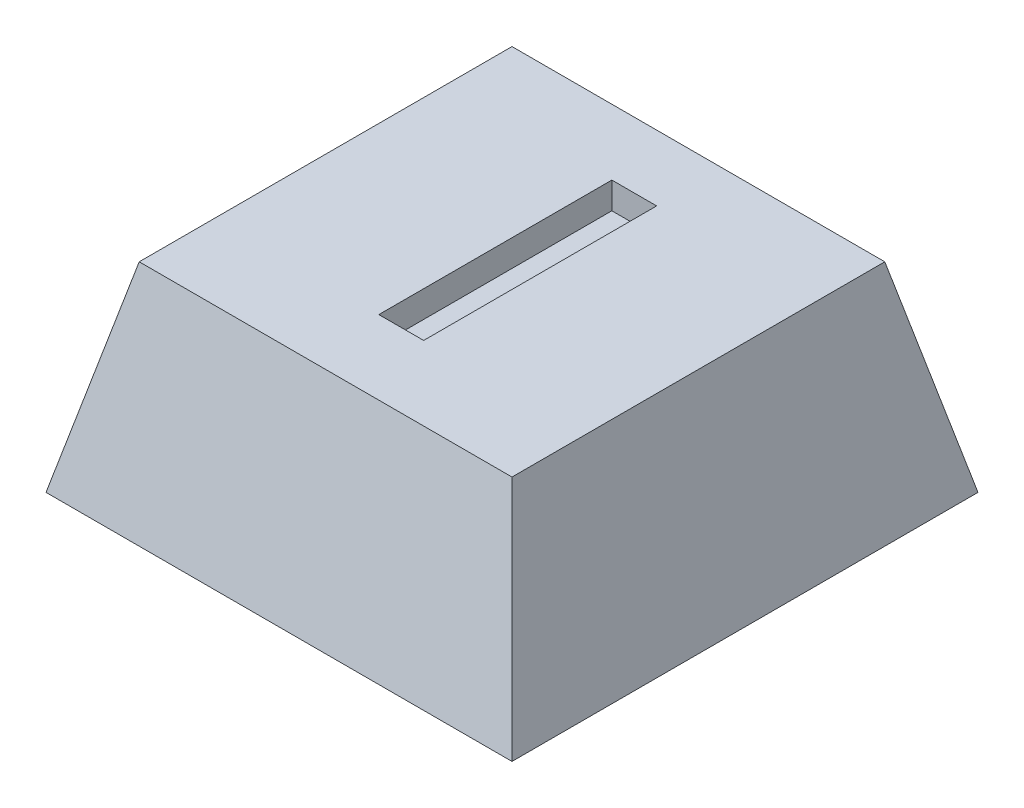
ISO-10303-21;
HEADER;
FILE_DESCRIPTION(('STEP AP214'),'2;1');
FILE_NAME('part.step','',(''),(''),'','','');
FILE_SCHEMA(('AUTOMOTIVE_DESIGN { 1 0 10303 214 1 1 1 1 }'));
ENDSEC;
DATA;
#1=APPLICATION_CONTEXT('core data for automotive mechanical design processes');
#2=APPLICATION_PROTOCOL_DEFINITION('international standard','automotive_design',2000,#1);
#3=PRODUCT_CONTEXT('',#1,'mechanical');
#4=PRODUCT('Part','Part','',(#3));
#5=PRODUCT_RELATED_PRODUCT_CATEGORY('part','',(#4));
#6=PRODUCT_DEFINITION_FORMATION('','',#4);
#7=PRODUCT_DEFINITION_CONTEXT('part definition',#1,'design');
#8=PRODUCT_DEFINITION('design','',#6,#7);
#9=PRODUCT_DEFINITION_SHAPE('','',#8);
#10=(LENGTH_UNIT() NAMED_UNIT(*) SI_UNIT(.MILLI.,.METRE.));
#11=(NAMED_UNIT(*) PLANE_ANGLE_UNIT() SI_UNIT($,.RADIAN.));
#12=(NAMED_UNIT(*) SI_UNIT($,.STERADIAN.) SOLID_ANGLE_UNIT());
#13=UNCERTAINTY_MEASURE_WITH_UNIT(LENGTH_MEASURE(1.E-05),#10,'distance_accuracy_value','');
#14=(GEOMETRIC_REPRESENTATION_CONTEXT(3) GLOBAL_UNCERTAINTY_ASSIGNED_CONTEXT((#13)) GLOBAL_UNIT_ASSIGNED_CONTEXT((#10,
#11,#12)) REPRESENTATION_CONTEXT('',''));
#15=CARTESIAN_POINT('',(0.,0.,0.));
#16=DIRECTION('',(0.,0.,1.));
#17=DIRECTION('',(1.,0.,0.));
#18=AXIS2_PLACEMENT_3D('',#15,#16,#17);
#19=CARTESIAN_POINT('',(0.,3.,0.));
#20=DIRECTION('',(0.,-1.,0.));
#21=DIRECTION('',(0.,0.,-1.));
#22=AXIS2_PLACEMENT_3D('',#19,#20,#21);
#23=PLANE('',#22);
#24=DIRECTION('',(-1.,0.,0.));
#25=VECTOR('',#24,1.);
#26=CARTESIAN_POINT('',(11.,3.,-0.7));
#27=LINE('',#26,#25);
#28=CARTESIAN_POINT('',(6.3,3.,-0.7));
#29=VERTEX_POINT('',#28);
#30=CARTESIAN_POINT('',(0.7,3.,-0.7));
#31=VERTEX_POINT('',#30);
#32=EDGE_CURVE('E66',#29,#31,#27,.T.);
#33=ORIENTED_EDGE('',*,*,#32,.F.);
#34=DIRECTION('',(0.,0.,1.));
#35=VECTOR('',#34,1.);
#36=CARTESIAN_POINT('',(6.3,3.,-7.));
#37=LINE('',#36,#35);
#38=CARTESIAN_POINT('',(6.3,3.,-6.3));
#39=VERTEX_POINT('',#38);
#40=EDGE_CURVE('E158',#39,#29,#37,.T.);
#41=ORIENTED_EDGE('',*,*,#40,.F.);
#42=DIRECTION('',(-1.,0.,0.));
#43=VECTOR('',#42,1.);
#44=CARTESIAN_POINT('',(11.,3.,-6.3));
#45=LINE('',#44,#43);
#46=CARTESIAN_POINT('',(0.699999999999998,3.,-6.3));
#47=VERTEX_POINT('',#46);
#48=EDGE_CURVE('E145',#39,#47,#45,.T.);
#49=ORIENTED_EDGE('',*,*,#48,.T.);
#50=DIRECTION('',(0.,0.,1.));
#51=VECTOR('',#50,1.);
#52=CARTESIAN_POINT('',(0.7,3.,-7.));
#53=LINE('',#52,#51);
#54=EDGE_CURVE('E159',#47,#31,#53,.T.);
#55=ORIENTED_EDGE('',*,*,#54,.T.);
#56=EDGE_LOOP('',(#33,#41,#49,#55));
#57=FACE_BOUND('',#56,.T.);
#58=DIRECTION('',(-1.,0.,0.));
#59=VECTOR('',#58,1.);
#60=CARTESIAN_POINT('',(3.85971149762524,3.,-1.81325809259612));
#61=LINE('',#60,#59);
#62=CARTESIAN_POINT('',(3.85971149762524,3.,-1.81325809259612));
#63=VERTEX_POINT('',#62);
#64=CARTESIAN_POINT('',(3.18663457454832,3.,-1.81325809259612));
#65=VERTEX_POINT('',#64);
#66=EDGE_CURVE('E59',#63,#65,#61,.T.);
#67=ORIENTED_EDGE('',*,*,#66,.T.);
#68=DIRECTION('',(0.,0.,-1.));
#69=VECTOR('',#68,1.);
#70=CARTESIAN_POINT('',(3.18663457454832,3.,-1.81325809259612));
#71=LINE('',#70,#69);
#72=CARTESIAN_POINT('',(3.18663457454832,3.,-5.31325809259612));
#73=VERTEX_POINT('',#72);
#74=EDGE_CURVE('E129',#65,#73,#71,.T.);
#75=ORIENTED_EDGE('',*,*,#74,.T.);
#76=DIRECTION('',(1.,0.,0.));
#77=VECTOR('',#76,1.);
#78=CARTESIAN_POINT('',(3.18663457454832,3.,-5.31325809259612));
#79=LINE('',#78,#77);
#80=CARTESIAN_POINT('',(3.85971149762524,3.,-5.31325809259612));
#81=VERTEX_POINT('',#80);
#82=EDGE_CURVE('E342',#73,#81,#79,.T.);
#83=ORIENTED_EDGE('',*,*,#82,.T.);
#84=DIRECTION('',(0.,0.,1.));
#85=VECTOR('',#84,1.);
#86=CARTESIAN_POINT('',(3.85971149762524,3.,-5.31325809259612));
#87=LINE('',#86,#85);
#88=EDGE_CURVE('E125',#81,#63,#87,.T.);
#89=ORIENTED_EDGE('',*,*,#88,.T.);
#90=EDGE_LOOP('',(#67,#75,#83,#89));
#91=FACE_BOUND('',#90,.T.);
#92=ADVANCED_FACE('F43',(#57,#91),#23,.F.);
#93=CARTESIAN_POINT('',(7.,0.,-7.));
#94=DIRECTION('',(-0.973841209741793,-0.227229615606418,0.));
#95=DIRECTION('',(0.227229615606418,-0.973841209741793,0.));
#96=AXIS2_PLACEMENT_3D('',#93,#94,#95);
#97=PLANE('',#96);
#98=DIRECTION('',(-0.221581128241521,0.949633406749377,-0.221581128241521));
#99=VECTOR('',#98,1.);
#100=CARTESIAN_POINT('',(6.6563126252505,1.47294589178357,-0.343687374749499));
#101=LINE('',#100,#99);
#102=CARTESIAN_POINT('',(7.,0.,0.));
#103=VERTEX_POINT('',#102);
#104=EDGE_CURVE('E155',#103,#29,#101,.T.);
#105=ORIENTED_EDGE('',*,*,#104,.F.);
#106=DIRECTION('',(0.,0.,-1.));
#107=VECTOR('',#106,1.);
#108=CARTESIAN_POINT('',(7.,0.,0.));
#109=LINE('',#108,#107);
#110=CARTESIAN_POINT('',(7.,0.,-7.));
#111=VERTEX_POINT('',#110);
#112=EDGE_CURVE('E173',#103,#111,#109,.T.);
#113=ORIENTED_EDGE('',*,*,#112,.T.);
#114=DIRECTION('',(0.221581128241521,-0.949633406749377,-0.221581128241521));
#115=VECTOR('',#114,1.);
#116=CARTESIAN_POINT('',(7.,0.,-7.));
#117=LINE('',#116,#115);
#118=EDGE_CURVE('E149',#39,#111,#117,.T.);
#119=ORIENTED_EDGE('',*,*,#118,.F.);
#120=ORIENTED_EDGE('',*,*,#40,.T.);
#121=EDGE_LOOP('',(#105,#113,#119,#120));
#122=FACE_BOUND('',#121,.T.);
#123=ADVANCED_FACE('F198',(#122),#97,.F.);
#124=CARTESIAN_POINT('',(0.,0.,-7.));
#125=DIRECTION('',(0.973841209741793,-0.227229615606418,0.));
#126=DIRECTION('',(0.227229615606418,0.973841209741793,0.));
#127=AXIS2_PLACEMENT_3D('',#124,#125,#126);
#128=PLANE('',#127);
#129=DIRECTION('',(-0.221581128241521,-0.949633406749378,0.221581128241521));
#130=VECTOR('',#129,1.);
#131=CARTESIAN_POINT('',(0.343687374749499,1.47294589178357,-0.3436873747495));
#132=LINE('',#131,#130);
#133=CARTESIAN_POINT('',(0.,0.,0.));
#134=VERTEX_POINT('',#133);
#135=EDGE_CURVE('E11',#31,#134,#132,.T.);
#136=ORIENTED_EDGE('',*,*,#135,.F.);
#137=ORIENTED_EDGE('',*,*,#54,.F.);
#138=DIRECTION('',(0.221581128241521,0.949633406749377,0.221581128241521));
#139=VECTOR('',#138,1.);
#140=CARTESIAN_POINT('',(0.,0.,-7.));
#141=LINE('',#140,#139);
#142=CARTESIAN_POINT('',(0.,0.,-7.));
#143=VERTEX_POINT('',#142);
#144=EDGE_CURVE('E52',#143,#47,#141,.T.);
#145=ORIENTED_EDGE('',*,*,#144,.F.);
#146=DIRECTION('',(0.,0.,1.));
#147=VECTOR('',#146,1.);
#148=CARTESIAN_POINT('',(0.,0.,0.));
#149=LINE('',#148,#147);
#150=EDGE_CURVE('E163',#143,#134,#149,.T.);
#151=ORIENTED_EDGE('',*,*,#150,.T.);
#152=EDGE_LOOP('',(#136,#137,#145,#151));
#153=FACE_BOUND('',#152,.T.);
#154=ADVANCED_FACE('F191',(#153),#128,.F.);
#155=CARTESIAN_POINT('',(0.,0.,0.));
#156=DIRECTION('',(0.,-1.,0.));
#157=DIRECTION('',(0.,0.,-1.));
#158=AXIS2_PLACEMENT_3D('',#155,#156,#157);
#159=PLANE('',#158);
#160=CARTESIAN_POINT('',(3.5,0.,-3.5));
#161=DIRECTION('',(0.,-1.,0.));
#162=DIRECTION('',(0.,0.,-1.));
#163=AXIS2_PLACEMENT_3D('',#160,#161,#162);
#164=CIRCLE('',#163,1.8);
#165=CARTESIAN_POINT('',(3.5,0.,-5.3));
#166=VERTEX_POINT('',#165);
#167=EDGE_CURVE('E131',#166,#166,#164,.T.);
#168=ORIENTED_EDGE('',*,*,#167,.F.);
#169=EDGE_LOOP('',(#168));
#170=FACE_BOUND('',#169,.T.);
#171=ORIENTED_EDGE('',*,*,#150,.F.);
#172=DIRECTION('',(-1.,0.,0.));
#173=VECTOR('',#172,1.);
#174=CARTESIAN_POINT('',(0.,0.,-7.));
#175=LINE('',#174,#173);
#176=EDGE_CURVE('E177',#111,#143,#175,.T.);
#177=ORIENTED_EDGE('',*,*,#176,.F.);
#178=ORIENTED_EDGE('',*,*,#112,.F.);
#179=DIRECTION('',(1.,0.,0.));
#180=VECTOR('',#179,1.);
#181=CARTESIAN_POINT('',(0.,0.,0.));
#182=LINE('',#181,#180);
#183=EDGE_CURVE('E170',#134,#103,#182,.T.);
#184=ORIENTED_EDGE('',*,*,#183,.F.);
#185=EDGE_LOOP('',(#171,#177,#178,#184));
#186=FACE_BOUND('',#185,.T.);
#187=ADVANCED_FACE('F45',(#170,#186),#159,.T.);
#188=CARTESIAN_POINT('',(11.,3.,-6.3));
#189=DIRECTION('',(0.,0.227229615606418,-0.973841209741793));
#190=DIRECTION('',(0.,0.973841209741793,0.227229615606418));
#191=AXIS2_PLACEMENT_3D('',#188,#189,#190);
#192=PLANE('',#191);
#193=ORIENTED_EDGE('',*,*,#118,.T.);
#194=ORIENTED_EDGE('',*,*,#176,.T.);
#195=ORIENTED_EDGE('',*,*,#144,.T.);
#196=ORIENTED_EDGE('',*,*,#48,.F.);
#197=EDGE_LOOP('',(#193,#194,#195,#196));
#198=FACE_BOUND('',#197,.T.);
#199=ADVANCED_FACE('F182',(#198),#192,.T.);
#200=CARTESIAN_POINT('',(11.,0.,0.));
#201=DIRECTION('',(0.,0.227229615606418,0.973841209741793));
#202=DIRECTION('',(0.,-0.973841209741793,0.227229615606418));
#203=AXIS2_PLACEMENT_3D('',#200,#201,#202);
#204=PLANE('',#203);
#205=ORIENTED_EDGE('',*,*,#104,.T.);
#206=ORIENTED_EDGE('',*,*,#32,.T.);
#207=ORIENTED_EDGE('',*,*,#135,.T.);
#208=ORIENTED_EDGE('',*,*,#183,.T.);
#209=EDGE_LOOP('',(#205,#206,#207,#208));
#210=FACE_BOUND('',#209,.T.);
#211=ADVANCED_FACE('F193',(#210),#204,.T.);
#212=CARTESIAN_POINT('',(3.5,0.8,-3.5));
#213=DIRECTION('',(0.,-1.,0.));
#214=DIRECTION('',(0.,0.,-1.));
#215=AXIS2_PLACEMENT_3D('',#212,#213,#214);
#216=CYLINDRICAL_SURFACE('',#215,1.8);
#217=CARTESIAN_POINT('',(3.5,0.8,-3.5));
#218=DIRECTION('',(0.,-1.,0.));
#219=DIRECTION('',(0.,0.,-1.));
#220=AXIS2_PLACEMENT_3D('',#217,#218,#219);
#221=CIRCLE('',#220,1.8);
#222=CARTESIAN_POINT('',(3.5,0.8,-5.3));
#223=VERTEX_POINT('',#222);
#224=EDGE_CURVE('E137',#223,#223,#221,.T.);
#225=ORIENTED_EDGE('',*,*,#224,.F.);
#226=EDGE_LOOP('',(#225));
#227=FACE_BOUND('',#226,.T.);
#228=ORIENTED_EDGE('',*,*,#167,.T.);
#229=EDGE_LOOP('',(#228));
#230=FACE_BOUND('',#229,.T.);
#231=ADVANCED_FACE('F216',(#227,#230),#216,.F.);
#232=CARTESIAN_POINT('',(3.5,0.8,-3.5));
#233=DIRECTION('',(0.,-1.,0.));
#234=DIRECTION('',(0.,0.,-1.));
#235=AXIS2_PLACEMENT_3D('',#232,#233,#234);
#236=PLANE('',#235);
#237=ORIENTED_EDGE('',*,*,#224,.T.);
#238=EDGE_LOOP('',(#237));
#239=FACE_BOUND('',#238,.T.);
#240=ADVANCED_FACE('F219',(#239),#236,.T.);
#241=CARTESIAN_POINT('',(3.85971149762524,2.6,-1.81325809259612));
#242=DIRECTION('',(0.,0.,-1.));
#243=DIRECTION('',(-1.,0.,0.));
#244=AXIS2_PLACEMENT_3D('',#241,#242,#243);
#245=PLANE('',#244);
#246=ORIENTED_EDGE('',*,*,#66,.F.);
#247=DIRECTION('',(0.,1.,0.));
#248=VECTOR('',#247,1.);
#249=CARTESIAN_POINT('',(3.85971149762524,2.6,-1.81325809259612));
#250=LINE('',#249,#248);
#251=CARTESIAN_POINT('',(3.85971149762524,2.6,-1.81325809259612));
#252=VERTEX_POINT('',#251);
#253=EDGE_CURVE('E123',#252,#63,#250,.T.);
#254=ORIENTED_EDGE('',*,*,#253,.F.);
#255=DIRECTION('',(-1.,0.,0.));
#256=VECTOR('',#255,1.);
#257=CARTESIAN_POINT('',(3.85971149762524,2.6,-1.81325809259612));
#258=LINE('',#257,#256);
#259=CARTESIAN_POINT('',(3.18663457454832,2.6,-1.81325809259612));
#260=VERTEX_POINT('',#259);
#261=EDGE_CURVE('E114',#252,#260,#258,.T.);
#262=ORIENTED_EDGE('',*,*,#261,.T.);
#263=DIRECTION('',(0.,1.,0.));
#264=VECTOR('',#263,1.);
#265=CARTESIAN_POINT('',(3.18663457454832,2.6,-1.81325809259612));
#266=LINE('',#265,#264);
#267=EDGE_CURVE('E122',#260,#65,#266,.T.);
#268=ORIENTED_EDGE('',*,*,#267,.T.);
#269=EDGE_LOOP('',(#246,#254,#262,#268));
#270=FACE_BOUND('',#269,.T.);
#271=ADVANCED_FACE('F121',(#270),#245,.T.);
#272=CARTESIAN_POINT('',(3.18663457454832,2.6,-1.81325809259612));
#273=DIRECTION('',(1.,0.,0.));
#274=DIRECTION('',(0.,0.,-1.));
#275=AXIS2_PLACEMENT_3D('',#272,#273,#274);
#276=PLANE('',#275);
#277=ORIENTED_EDGE('',*,*,#74,.F.);
#278=ORIENTED_EDGE('',*,*,#267,.F.);
#279=DIRECTION('',(0.,0.,-1.));
#280=VECTOR('',#279,1.);
#281=CARTESIAN_POINT('',(3.18663457454832,2.6,-1.81325809259612));
#282=LINE('',#281,#280);
#283=CARTESIAN_POINT('',(3.18663457454832,2.6,-5.31325809259612));
#284=VERTEX_POINT('',#283);
#285=EDGE_CURVE('E110',#260,#284,#282,.T.);
#286=ORIENTED_EDGE('',*,*,#285,.T.);
#287=DIRECTION('',(0.,1.,0.));
#288=VECTOR('',#287,1.);
#289=CARTESIAN_POINT('',(3.18663457454832,2.6,-5.31325809259612));
#290=LINE('',#289,#288);
#291=EDGE_CURVE('E132',#284,#73,#290,.T.);
#292=ORIENTED_EDGE('',*,*,#291,.T.);
#293=EDGE_LOOP('',(#277,#278,#286,#292));
#294=FACE_BOUND('',#293,.T.);
#295=ADVANCED_FACE('F127',(#294),#276,.T.);
#296=CARTESIAN_POINT('',(3.18663457454832,2.6,-5.31325809259612));
#297=DIRECTION('',(0.,0.,1.));
#298=DIRECTION('',(1.,0.,0.));
#299=AXIS2_PLACEMENT_3D('',#296,#297,#298);
#300=PLANE('',#299);
#301=ORIENTED_EDGE('',*,*,#82,.F.);
#302=ORIENTED_EDGE('',*,*,#291,.F.);
#303=DIRECTION('',(1.,0.,0.));
#304=VECTOR('',#303,1.);
#305=CARTESIAN_POINT('',(3.18663457454832,2.6,-5.31325809259612));
#306=LINE('',#305,#304);
#307=CARTESIAN_POINT('',(3.85971149762524,2.6,-5.31325809259612));
#308=VERTEX_POINT('',#307);
#309=EDGE_CURVE('E115',#284,#308,#306,.T.);
#310=ORIENTED_EDGE('',*,*,#309,.T.);
#311=DIRECTION('',(0.,1.,0.));
#312=VECTOR('',#311,1.);
#313=CARTESIAN_POINT('',(3.85971149762524,2.6,-5.31325809259612));
#314=LINE('',#313,#312);
#315=EDGE_CURVE('E139',#308,#81,#314,.T.);
#316=ORIENTED_EDGE('',*,*,#315,.T.);
#317=EDGE_LOOP('',(#301,#302,#310,#316));
#318=FACE_BOUND('',#317,.T.);
#319=ADVANCED_FACE('F228',(#318),#300,.T.);
#320=CARTESIAN_POINT('',(3.85971149762524,2.6,-5.31325809259612));
#321=DIRECTION('',(-1.,0.,0.));
#322=DIRECTION('',(0.,0.,1.));
#323=AXIS2_PLACEMENT_3D('',#320,#321,#322);
#324=PLANE('',#323);
#325=ORIENTED_EDGE('',*,*,#88,.F.);
#326=ORIENTED_EDGE('',*,*,#315,.F.);
#327=DIRECTION('',(0.,0.,1.));
#328=VECTOR('',#327,1.);
#329=CARTESIAN_POINT('',(3.85971149762524,2.6,-5.31325809259612));
#330=LINE('',#329,#328);
#331=EDGE_CURVE('E352',#308,#252,#330,.T.);
#332=ORIENTED_EDGE('',*,*,#331,.T.);
#333=ORIENTED_EDGE('',*,*,#253,.T.);
#334=EDGE_LOOP('',(#325,#326,#332,#333));
#335=FACE_BOUND('',#334,.T.);
#336=ADVANCED_FACE('F231',(#335),#324,.T.);
#337=CARTESIAN_POINT('',(0.,2.6,0.));
#338=DIRECTION('',(0.,-1.,0.));
#339=DIRECTION('',(0.,0.,-1.));
#340=AXIS2_PLACEMENT_3D('',#337,#338,#339);
#341=PLANE('',#340);
#342=ORIENTED_EDGE('',*,*,#261,.F.);
#343=ORIENTED_EDGE('',*,*,#331,.F.);
#344=ORIENTED_EDGE('',*,*,#309,.F.);
#345=ORIENTED_EDGE('',*,*,#285,.F.);
#346=EDGE_LOOP('',(#342,#343,#344,#345));
#347=FACE_BOUND('',#346,.T.);
#348=ADVANCED_FACE('F112',(#347),#341,.F.);
#349=CLOSED_SHELL('',(#92,#123,#154,#187,#199,#211,#231,#240,#271,#295,#319,#336,#348));
#350=MANIFOLD_SOLID_BREP('B2',#349);
#351=ADVANCED_BREP_SHAPE_REPRESENTATION('',(#18,#350),#14);
#352=SHAPE_DEFINITION_REPRESENTATION(#9,#351);
ENDSEC;
END-ISO-10303-21;
